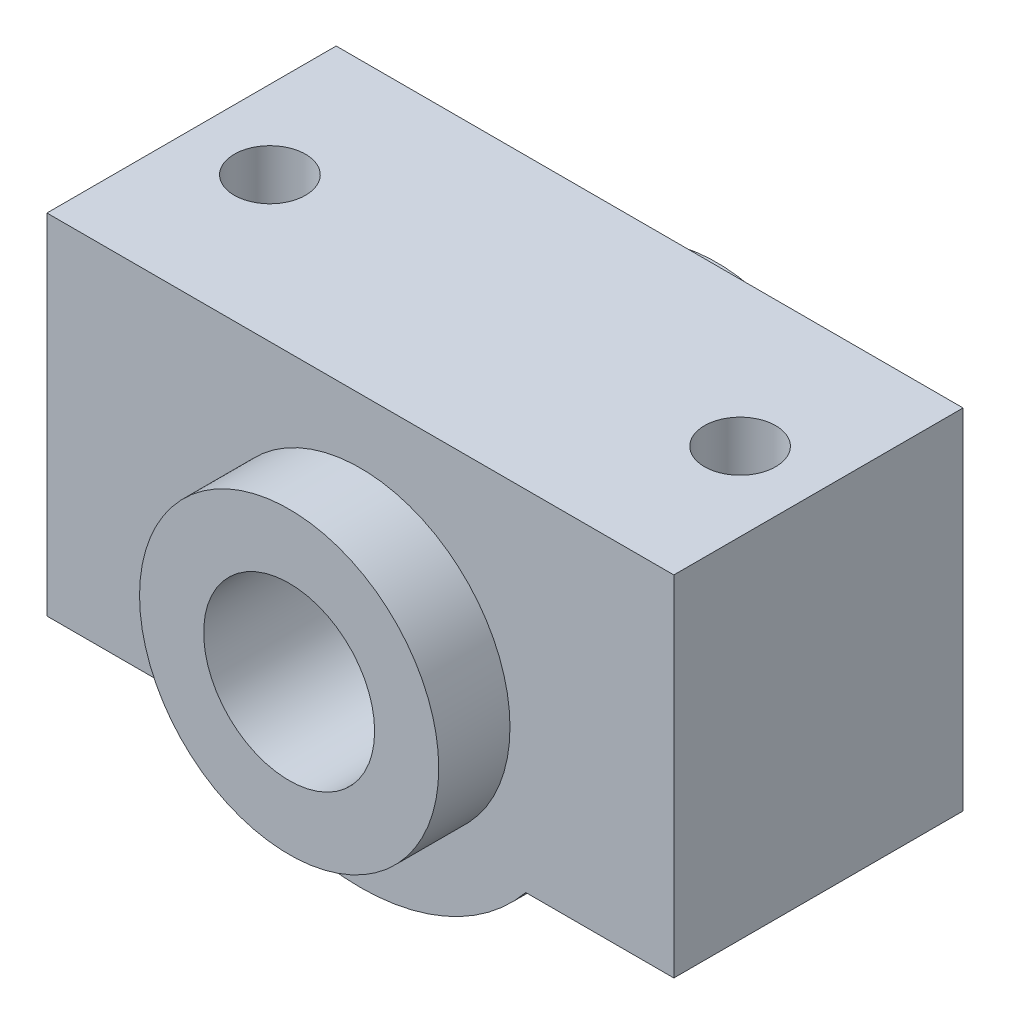
ISO-10303-21;
HEADER;
FILE_DESCRIPTION(('STEP AP214'),'2;1');
FILE_NAME('part.step','',(''),(''),'','','');
FILE_SCHEMA(('AUTOMOTIVE_DESIGN { 1 0 10303 214 1 1 1 1 }'));
ENDSEC;
DATA;
#1=APPLICATION_CONTEXT('core data for automotive mechanical design processes');
#2=APPLICATION_PROTOCOL_DEFINITION('international standard','automotive_design',2000,#1);
#3=PRODUCT_CONTEXT('',#1,'mechanical');
#4=PRODUCT('Part','Part','',(#3));
#5=PRODUCT_RELATED_PRODUCT_CATEGORY('part','',(#4));
#6=PRODUCT_DEFINITION_FORMATION('','',#4);
#7=PRODUCT_DEFINITION_CONTEXT('part definition',#1,'design');
#8=PRODUCT_DEFINITION('design','',#6,#7);
#9=PRODUCT_DEFINITION_SHAPE('','',#8);
#10=(LENGTH_UNIT() NAMED_UNIT(*) SI_UNIT(.MILLI.,.METRE.));
#11=(NAMED_UNIT(*) PLANE_ANGLE_UNIT() SI_UNIT($,.RADIAN.));
#12=(NAMED_UNIT(*) SI_UNIT($,.STERADIAN.) SOLID_ANGLE_UNIT());
#13=UNCERTAINTY_MEASURE_WITH_UNIT(LENGTH_MEASURE(1.E-05),#10,'distance_accuracy_value','');
#14=(GEOMETRIC_REPRESENTATION_CONTEXT(3) GLOBAL_UNCERTAINTY_ASSIGNED_CONTEXT((#13)) GLOBAL_UNIT_ASSIGNED_CONTEXT((#10,
#11,#12)) REPRESENTATION_CONTEXT('',''));
#15=CARTESIAN_POINT('',(0.,0.,0.));
#16=DIRECTION('',(0.,0.,1.));
#17=DIRECTION('',(1.,0.,0.));
#18=AXIS2_PLACEMENT_3D('',#15,#16,#17);
#19=CARTESIAN_POINT('',(0.,0.,20.3));
#20=DIRECTION('',(0.,0.,1.));
#21=DIRECTION('',(1.,0.,0.));
#22=AXIS2_PLACEMENT_3D('',#19,#20,#21);
#23=PLANE('',#22);
#24=CARTESIAN_POINT('',(0.,0.,20.3));
#25=DIRECTION('',(0.,0.,1.));
#26=DIRECTION('',(1.,0.,0.));
#27=AXIS2_PLACEMENT_3D('',#24,#25,#26);
#28=CIRCLE('',#27,10.5);
#29=CARTESIAN_POINT('',(10.5,0.,20.3));
#30=VERTEX_POINT('',#29);
#31=EDGE_CURVE('E11',#30,#30,#28,.T.);
#32=ORIENTED_EDGE('',*,*,#31,.F.);
#33=EDGE_LOOP('',(#32));
#34=FACE_BOUND('',#33,.T.);
#35=CARTESIAN_POINT('',(0.,0.,20.3));
#36=DIRECTION('',(0.,0.,1.));
#37=DIRECTION('',(1.,0.,0.));
#38=AXIS2_PLACEMENT_3D('',#35,#36,#37);
#39=CIRCLE('',#38,15.);
#40=CARTESIAN_POINT('',(-11.6081867662439,-9.50000000000001,20.3));
#41=VERTEX_POINT('',#40);
#42=CARTESIAN_POINT('',(11.6081867662439,-9.50000000000001,20.3));
#43=VERTEX_POINT('',#42);
#44=EDGE_CURVE('E131',#41,#43,#39,.T.);
#45=ORIENTED_EDGE('',*,*,#44,.T.);
#46=DIRECTION('',(1.,0.,0.));
#47=VECTOR('',#46,1.);
#48=CARTESIAN_POINT('',(11.6081867662439,-9.50000000000001,20.3));
#49=LINE('',#48,#47);
#50=CARTESIAN_POINT('',(22.,-9.50000000000001,20.3));
#51=VERTEX_POINT('',#50);
#52=EDGE_CURVE('E90',#43,#51,#49,.T.);
#53=ORIENTED_EDGE('',*,*,#52,.T.);
#54=DIRECTION('',(0.,1.,0.));
#55=VECTOR('',#54,1.);
#56=CARTESIAN_POINT('',(22.,15.,20.3));
#57=LINE('',#56,#55);
#58=CARTESIAN_POINT('',(22.,15.,20.3));
#59=VERTEX_POINT('',#58);
#60=EDGE_CURVE('E102',#51,#59,#57,.T.);
#61=ORIENTED_EDGE('',*,*,#60,.T.);
#62=DIRECTION('',(-1.,0.,0.));
#63=VECTOR('',#62,1.);
#64=CARTESIAN_POINT('',(-22.,15.,20.3));
#65=LINE('',#64,#63);
#66=CARTESIAN_POINT('',(-22.,15.,20.3));
#67=VERTEX_POINT('',#66);
#68=EDGE_CURVE('E97',#59,#67,#65,.T.);
#69=ORIENTED_EDGE('',*,*,#68,.T.);
#70=DIRECTION('',(0.,-1.,0.));
#71=VECTOR('',#70,1.);
#72=CARTESIAN_POINT('',(-22.,15.,20.3));
#73=LINE('',#72,#71);
#74=CARTESIAN_POINT('',(-22.,-9.50000000000001,20.3));
#75=VERTEX_POINT('',#74);
#76=EDGE_CURVE('E100',#67,#75,#73,.T.);
#77=ORIENTED_EDGE('',*,*,#76,.T.);
#78=DIRECTION('',(1.,0.,0.));
#79=VECTOR('',#78,1.);
#80=CARTESIAN_POINT('',(-22.,-9.50000000000001,20.3));
#81=LINE('',#80,#79);
#82=EDGE_CURVE('E52',#75,#41,#81,.T.);
#83=ORIENTED_EDGE('',*,*,#82,.T.);
#84=EDGE_LOOP('',(#45,#53,#61,#69,#77,#83));
#85=FACE_BOUND('',#84,.T.);
#86=ADVANCED_FACE('F33',(#34,#85),#23,.T.);
#87=CARTESIAN_POINT('',(0.,0.,0.));
#88=DIRECTION('',(0.,0.,1.));
#89=DIRECTION('',(1.,0.,0.));
#90=AXIS2_PLACEMENT_3D('',#87,#88,#89);
#91=PLANE('',#90);
#92=CARTESIAN_POINT('',(0.,0.,0.));
#93=DIRECTION('',(0.,0.,1.));
#94=DIRECTION('',(1.,0.,0.));
#95=AXIS2_PLACEMENT_3D('',#92,#93,#94);
#96=CIRCLE('',#95,10.5);
#97=CARTESIAN_POINT('',(10.5,0.,0.));
#98=VERTEX_POINT('',#97);
#99=EDGE_CURVE('E124',#98,#98,#96,.T.);
#100=ORIENTED_EDGE('',*,*,#99,.T.);
#101=EDGE_LOOP('',(#100));
#102=FACE_BOUND('',#101,.T.);
#103=CARTESIAN_POINT('',(0.,0.,0.));
#104=DIRECTION('',(0.,0.,1.));
#105=DIRECTION('',(1.,0.,0.));
#106=AXIS2_PLACEMENT_3D('',#103,#104,#105);
#107=CIRCLE('',#106,15.);
#108=CARTESIAN_POINT('',(-11.6081867662439,-9.50000000000001,0.));
#109=VERTEX_POINT('',#108);
#110=CARTESIAN_POINT('',(11.6081867662439,-9.50000000000001,0.));
#111=VERTEX_POINT('',#110);
#112=EDGE_CURVE('E120',#109,#111,#107,.T.);
#113=ORIENTED_EDGE('',*,*,#112,.F.);
#114=DIRECTION('',(1.,0.,0.));
#115=VECTOR('',#114,1.);
#116=CARTESIAN_POINT('',(-22.,-9.50000000000001,0.));
#117=LINE('',#116,#115);
#118=CARTESIAN_POINT('',(-22.,-9.50000000000001,0.));
#119=VERTEX_POINT('',#118);
#120=EDGE_CURVE('E81',#119,#109,#117,.T.);
#121=ORIENTED_EDGE('',*,*,#120,.F.);
#122=DIRECTION('',(0.,-1.,0.));
#123=VECTOR('',#122,1.);
#124=CARTESIAN_POINT('',(-22.,15.,0.));
#125=LINE('',#124,#123);
#126=CARTESIAN_POINT('',(-22.,15.,0.));
#127=VERTEX_POINT('',#126);
#128=EDGE_CURVE('E75',#127,#119,#125,.T.);
#129=ORIENTED_EDGE('',*,*,#128,.F.);
#130=DIRECTION('',(-1.,0.,0.));
#131=VECTOR('',#130,1.);
#132=CARTESIAN_POINT('',(-22.,15.,0.));
#133=LINE('',#132,#131);
#134=CARTESIAN_POINT('',(22.,15.,0.));
#135=VERTEX_POINT('',#134);
#136=EDGE_CURVE('E110',#135,#127,#133,.T.);
#137=ORIENTED_EDGE('',*,*,#136,.F.);
#138=DIRECTION('',(0.,1.,0.));
#139=VECTOR('',#138,1.);
#140=CARTESIAN_POINT('',(22.,15.,0.));
#141=LINE('',#140,#139);
#142=CARTESIAN_POINT('',(22.,-9.50000000000001,0.));
#143=VERTEX_POINT('',#142);
#144=EDGE_CURVE('E126',#143,#135,#141,.T.);
#145=ORIENTED_EDGE('',*,*,#144,.F.);
#146=DIRECTION('',(1.,0.,0.));
#147=VECTOR('',#146,1.);
#148=CARTESIAN_POINT('',(11.6081867662439,-9.50000000000001,0.));
#149=LINE('',#148,#147);
#150=EDGE_CURVE('E123',#111,#143,#149,.T.);
#151=ORIENTED_EDGE('',*,*,#150,.F.);
#152=EDGE_LOOP('',(#113,#121,#129,#137,#145,#151));
#153=FACE_BOUND('',#152,.T.);
#154=ADVANCED_FACE('F161',(#102,#153),#91,.F.);
#155=CARTESIAN_POINT('',(0.,0.,20.3));
#156=DIRECTION('',(0.,0.,-1.));
#157=DIRECTION('',(-1.,0.,0.));
#158=AXIS2_PLACEMENT_3D('',#155,#156,#157);
#159=CYLINDRICAL_SURFACE('',#158,15.);
#160=ORIENTED_EDGE('',*,*,#112,.T.);
#161=DIRECTION('',(0.,0.,-1.));
#162=VECTOR('',#161,1.);
#163=CARTESIAN_POINT('',(11.6081867662439,-9.50000000000001,20.3));
#164=LINE('',#163,#162);
#165=EDGE_CURVE('E43',#43,#111,#164,.T.);
#166=ORIENTED_EDGE('',*,*,#165,.F.);
#167=ORIENTED_EDGE('',*,*,#44,.F.);
#168=DIRECTION('',(0.,0.,-1.));
#169=VECTOR('',#168,1.);
#170=CARTESIAN_POINT('',(-11.6081867662439,-9.50000000000001,20.3));
#171=LINE('',#170,#169);
#172=EDGE_CURVE('E116',#41,#109,#171,.T.);
#173=ORIENTED_EDGE('',*,*,#172,.T.);
#174=EDGE_LOOP('',(#160,#166,#167,#173));
#175=FACE_BOUND('',#174,.T.);
#176=ADVANCED_FACE('F35',(#175),#159,.T.);
#177=CARTESIAN_POINT('',(11.6081867662439,-9.50000000000001,20.3));
#178=DIRECTION('',(0.,1.,0.));
#179=DIRECTION('',(0.,0.,1.));
#180=AXIS2_PLACEMENT_3D('',#177,#178,#179);
#181=PLANE('',#180);
#182=CARTESIAN_POINT('',(16.5,-9.50000000000001,10.15));
#183=DIRECTION('',(0.,1.,0.));
#184=DIRECTION('',(0.,0.,1.));
#185=AXIS2_PLACEMENT_3D('',#182,#183,#184);
#186=CIRCLE('',#185,2.5);
#187=CARTESIAN_POINT('',(16.5,-9.50000000000001,12.65));
#188=VERTEX_POINT('',#187);
#189=EDGE_CURVE('E213',#188,#188,#186,.T.);
#190=ORIENTED_EDGE('',*,*,#189,.T.);
#191=EDGE_LOOP('',(#190));
#192=FACE_BOUND('',#191,.T.);
#193=ORIENTED_EDGE('',*,*,#150,.T.);
#194=DIRECTION('',(0.,0.,-1.));
#195=VECTOR('',#194,1.);
#196=CARTESIAN_POINT('',(22.,-9.50000000000001,20.3));
#197=LINE('',#196,#195);
#198=EDGE_CURVE('E135',#51,#143,#197,.T.);
#199=ORIENTED_EDGE('',*,*,#198,.F.);
#200=ORIENTED_EDGE('',*,*,#52,.F.);
#201=ORIENTED_EDGE('',*,*,#165,.T.);
#202=EDGE_LOOP('',(#193,#199,#200,#201));
#203=FACE_BOUND('',#202,.T.);
#204=ADVANCED_FACE('F155',(#192,#203),#181,.F.);
#205=CARTESIAN_POINT('',(22.,15.,20.3));
#206=DIRECTION('',(-1.,0.,0.));
#207=DIRECTION('',(0.,0.,1.));
#208=AXIS2_PLACEMENT_3D('',#205,#206,#207);
#209=PLANE('',#208);
#210=ORIENTED_EDGE('',*,*,#144,.T.);
#211=DIRECTION('',(0.,0.,-1.));
#212=VECTOR('',#211,1.);
#213=CARTESIAN_POINT('',(22.,15.,20.3));
#214=LINE('',#213,#212);
#215=EDGE_CURVE('E111',#59,#135,#214,.T.);
#216=ORIENTED_EDGE('',*,*,#215,.F.);
#217=ORIENTED_EDGE('',*,*,#60,.F.);
#218=ORIENTED_EDGE('',*,*,#198,.T.);
#219=EDGE_LOOP('',(#210,#216,#217,#218));
#220=FACE_BOUND('',#219,.T.);
#221=ADVANCED_FACE('F158',(#220),#209,.F.);
#222=CARTESIAN_POINT('',(-22.,15.,20.3));
#223=DIRECTION('',(0.,-1.,0.));
#224=DIRECTION('',(0.,0.,-1.));
#225=AXIS2_PLACEMENT_3D('',#222,#223,#224);
#226=PLANE('',#225);
#227=CARTESIAN_POINT('',(-16.5,15.,10.15));
#228=DIRECTION('',(0.,1.,0.));
#229=DIRECTION('',(0.,0.,1.));
#230=AXIS2_PLACEMENT_3D('',#227,#228,#229);
#231=CIRCLE('',#230,2.5);
#232=CARTESIAN_POINT('',(-16.5,15.,12.65));
#233=VERTEX_POINT('',#232);
#234=EDGE_CURVE('E211',#233,#233,#231,.T.);
#235=ORIENTED_EDGE('',*,*,#234,.F.);
#236=EDGE_LOOP('',(#235));
#237=FACE_BOUND('',#236,.T.);
#238=CARTESIAN_POINT('',(16.5,15.,10.15));
#239=DIRECTION('',(0.,1.,0.));
#240=DIRECTION('',(0.,0.,1.));
#241=AXIS2_PLACEMENT_3D('',#238,#239,#240);
#242=CIRCLE('',#241,2.5);
#243=CARTESIAN_POINT('',(16.5,15.,12.65));
#244=VERTEX_POINT('',#243);
#245=EDGE_CURVE('E217',#244,#244,#242,.T.);
#246=ORIENTED_EDGE('',*,*,#245,.F.);
#247=EDGE_LOOP('',(#246));
#248=FACE_BOUND('',#247,.T.);
#249=ORIENTED_EDGE('',*,*,#136,.T.);
#250=DIRECTION('',(0.,0.,-1.));
#251=VECTOR('',#250,1.);
#252=CARTESIAN_POINT('',(-22.,15.,20.3));
#253=LINE('',#252,#251);
#254=EDGE_CURVE('E107',#67,#127,#253,.T.);
#255=ORIENTED_EDGE('',*,*,#254,.F.);
#256=ORIENTED_EDGE('',*,*,#68,.F.);
#257=ORIENTED_EDGE('',*,*,#215,.T.);
#258=EDGE_LOOP('',(#249,#255,#256,#257));
#259=FACE_BOUND('',#258,.T.);
#260=ADVANCED_FACE('F108',(#237,#248,#259),#226,.F.);
#261=CARTESIAN_POINT('',(-22.,15.,20.3));
#262=DIRECTION('',(1.,0.,0.));
#263=DIRECTION('',(0.,1.,0.));
#264=AXIS2_PLACEMENT_3D('',#261,#262,#263);
#265=PLANE('',#264);
#266=ORIENTED_EDGE('',*,*,#128,.T.);
#267=DIRECTION('',(0.,0.,-1.));
#268=VECTOR('',#267,1.);
#269=CARTESIAN_POINT('',(-22.,-9.50000000000001,20.3));
#270=LINE('',#269,#268);
#271=EDGE_CURVE('E112',#75,#119,#270,.T.);
#272=ORIENTED_EDGE('',*,*,#271,.F.);
#273=ORIENTED_EDGE('',*,*,#76,.F.);
#274=ORIENTED_EDGE('',*,*,#254,.T.);
#275=EDGE_LOOP('',(#266,#272,#273,#274));
#276=FACE_BOUND('',#275,.T.);
#277=ADVANCED_FACE('F114',(#276),#265,.F.);
#278=CARTESIAN_POINT('',(-22.,-9.50000000000001,20.3));
#279=DIRECTION('',(0.,1.,0.));
#280=DIRECTION('',(0.,0.,1.));
#281=AXIS2_PLACEMENT_3D('',#278,#279,#280);
#282=PLANE('',#281);
#283=CARTESIAN_POINT('',(-16.5,-9.50000000000001,10.15));
#284=DIRECTION('',(0.,1.,0.));
#285=DIRECTION('',(0.,0.,1.));
#286=AXIS2_PLACEMENT_3D('',#283,#284,#285);
#287=CIRCLE('',#286,2.5);
#288=CARTESIAN_POINT('',(-16.5,-9.50000000000001,12.65));
#289=VERTEX_POINT('',#288);
#290=EDGE_CURVE('E37',#289,#289,#287,.T.);
#291=ORIENTED_EDGE('',*,*,#290,.T.);
#292=EDGE_LOOP('',(#291));
#293=FACE_BOUND('',#292,.T.);
#294=ORIENTED_EDGE('',*,*,#120,.T.);
#295=ORIENTED_EDGE('',*,*,#172,.F.);
#296=ORIENTED_EDGE('',*,*,#82,.F.);
#297=ORIENTED_EDGE('',*,*,#271,.T.);
#298=EDGE_LOOP('',(#294,#295,#296,#297));
#299=FACE_BOUND('',#298,.T.);
#300=ADVANCED_FACE('F163',(#293,#299),#282,.F.);
#301=CARTESIAN_POINT('',(0.,0.,-4.7));
#302=DIRECTION('',(0.,0.,1.));
#303=DIRECTION('',(1.,0.,0.));
#304=AXIS2_PLACEMENT_3D('',#301,#302,#303);
#305=CYLINDRICAL_SURFACE('',#304,10.5);
#306=CARTESIAN_POINT('',(0.,0.,-4.7));
#307=DIRECTION('',(0.,0.,1.));
#308=DIRECTION('',(1.,0.,0.));
#309=AXIS2_PLACEMENT_3D('',#306,#307,#308);
#310=CIRCLE('',#309,10.5);
#311=CARTESIAN_POINT('',(10.5,0.,-4.7));
#312=VERTEX_POINT('',#311);
#313=EDGE_CURVE('E139',#312,#312,#310,.T.);
#314=ORIENTED_EDGE('',*,*,#313,.T.);
#315=EDGE_LOOP('',(#314));
#316=FACE_BOUND('',#315,.T.);
#317=ORIENTED_EDGE('',*,*,#99,.F.);
#318=EDGE_LOOP('',(#317));
#319=FACE_BOUND('',#318,.T.);
#320=ADVANCED_FACE('F165',(#316,#319),#305,.T.);
#321=CARTESIAN_POINT('',(0.,0.,-4.7));
#322=DIRECTION('',(0.,0.,1.));
#323=DIRECTION('',(1.,0.,0.));
#324=AXIS2_PLACEMENT_3D('',#321,#322,#323);
#325=PLANE('',#324);
#326=CARTESIAN_POINT('',(0.,0.,-4.7));
#327=DIRECTION('',(0.,0.,1.));
#328=DIRECTION('',(1.,0.,0.));
#329=AXIS2_PLACEMENT_3D('',#326,#327,#328);
#330=CIRCLE('',#329,6.);
#331=CARTESIAN_POINT('',(6.,0.,-4.7));
#332=VERTEX_POINT('',#331);
#333=EDGE_CURVE('E143',#332,#332,#330,.T.);
#334=ORIENTED_EDGE('',*,*,#333,.T.);
#335=EDGE_LOOP('',(#334));
#336=FACE_BOUND('',#335,.T.);
#337=ORIENTED_EDGE('',*,*,#313,.F.);
#338=EDGE_LOOP('',(#337));
#339=FACE_BOUND('',#338,.T.);
#340=ADVANCED_FACE('F172',(#336,#339),#325,.F.);
#341=CARTESIAN_POINT('',(0.,0.,20.3));
#342=DIRECTION('',(0.,0.,-1.));
#343=DIRECTION('',(-1.,0.,0.));
#344=AXIS2_PLACEMENT_3D('',#341,#342,#343);
#345=CYLINDRICAL_SURFACE('',#344,6.);
#346=ORIENTED_EDGE('',*,*,#333,.F.);
#347=EDGE_LOOP('',(#346));
#348=FACE_BOUND('',#347,.T.);
#349=CARTESIAN_POINT('',(0.,0.,25.3));
#350=DIRECTION('',(0.,0.,1.));
#351=DIRECTION('',(1.,0.,0.));
#352=AXIS2_PLACEMENT_3D('',#349,#350,#351);
#353=CIRCLE('',#352,6.);
#354=CARTESIAN_POINT('',(6.,0.,25.3));
#355=VERTEX_POINT('',#354);
#356=EDGE_CURVE('E215',#355,#355,#353,.T.);
#357=ORIENTED_EDGE('',*,*,#356,.T.);
#358=EDGE_LOOP('',(#357));
#359=FACE_BOUND('',#358,.T.);
#360=ADVANCED_FACE('F186',(#348,#359),#345,.F.);
#361=ORIENTED_EDGE('',*,*,#31,.T.);
#362=EDGE_LOOP('',(#361));
#363=FACE_BOUND('',#362,.T.);
#364=CARTESIAN_POINT('',(0.,0.,25.3));
#365=DIRECTION('',(0.,0.,1.));
#366=DIRECTION('',(1.,0.,0.));
#367=AXIS2_PLACEMENT_3D('',#364,#365,#366);
#368=CIRCLE('',#367,10.5);
#369=CARTESIAN_POINT('',(10.5,0.,25.3));
#370=VERTEX_POINT('',#369);
#371=EDGE_CURVE('E148',#370,#370,#368,.T.);
#372=ORIENTED_EDGE('',*,*,#371,.F.);
#373=EDGE_LOOP('',(#372));
#374=FACE_BOUND('',#373,.T.);
#375=ADVANCED_FACE('F174',(#363,#374),#305,.T.);
#376=CARTESIAN_POINT('',(0.,0.,25.3));
#377=DIRECTION('',(0.,0.,1.));
#378=DIRECTION('',(1.,0.,0.));
#379=AXIS2_PLACEMENT_3D('',#376,#377,#378);
#380=PLANE('',#379);
#381=ORIENTED_EDGE('',*,*,#371,.T.);
#382=EDGE_LOOP('',(#381));
#383=FACE_BOUND('',#382,.T.);
#384=ORIENTED_EDGE('',*,*,#356,.F.);
#385=EDGE_LOOP('',(#384));
#386=FACE_BOUND('',#385,.T.);
#387=ADVANCED_FACE('F191',(#383,#386),#380,.T.);
#388=CARTESIAN_POINT('',(-16.5,-15.,10.15));
#389=DIRECTION('',(0.,1.,0.));
#390=DIRECTION('',(0.,0.,1.));
#391=AXIS2_PLACEMENT_3D('',#388,#389,#390);
#392=CYLINDRICAL_SURFACE('',#391,2.5);
#393=ORIENTED_EDGE('',*,*,#234,.T.);
#394=EDGE_LOOP('',(#393));
#395=FACE_BOUND('',#394,.T.);
#396=ORIENTED_EDGE('',*,*,#290,.F.);
#397=EDGE_LOOP('',(#396));
#398=FACE_BOUND('',#397,.T.);
#399=ADVANCED_FACE('F198',(#395,#398),#392,.F.);
#400=CARTESIAN_POINT('',(16.5,-15.,10.15));
#401=DIRECTION('',(0.,1.,0.));
#402=DIRECTION('',(0.,0.,1.));
#403=AXIS2_PLACEMENT_3D('',#400,#401,#402);
#404=CYLINDRICAL_SURFACE('',#403,2.5);
#405=ORIENTED_EDGE('',*,*,#245,.T.);
#406=EDGE_LOOP('',(#405));
#407=FACE_BOUND('',#406,.T.);
#408=ORIENTED_EDGE('',*,*,#189,.F.);
#409=EDGE_LOOP('',(#408));
#410=FACE_BOUND('',#409,.T.);
#411=ADVANCED_FACE('F200',(#407,#410),#404,.F.);
#412=CLOSED_SHELL('',(#86,#154,#176,#204,#221,#260,#277,#300,#320,#340,#360,#375,#387,#399,#411));
#413=MANIFOLD_SOLID_BREP('B2',#412);
#414=ADVANCED_BREP_SHAPE_REPRESENTATION('',(#18,#413),#14);
#415=SHAPE_DEFINITION_REPRESENTATION(#9,#414);
ENDSEC;
END-ISO-10303-21;
